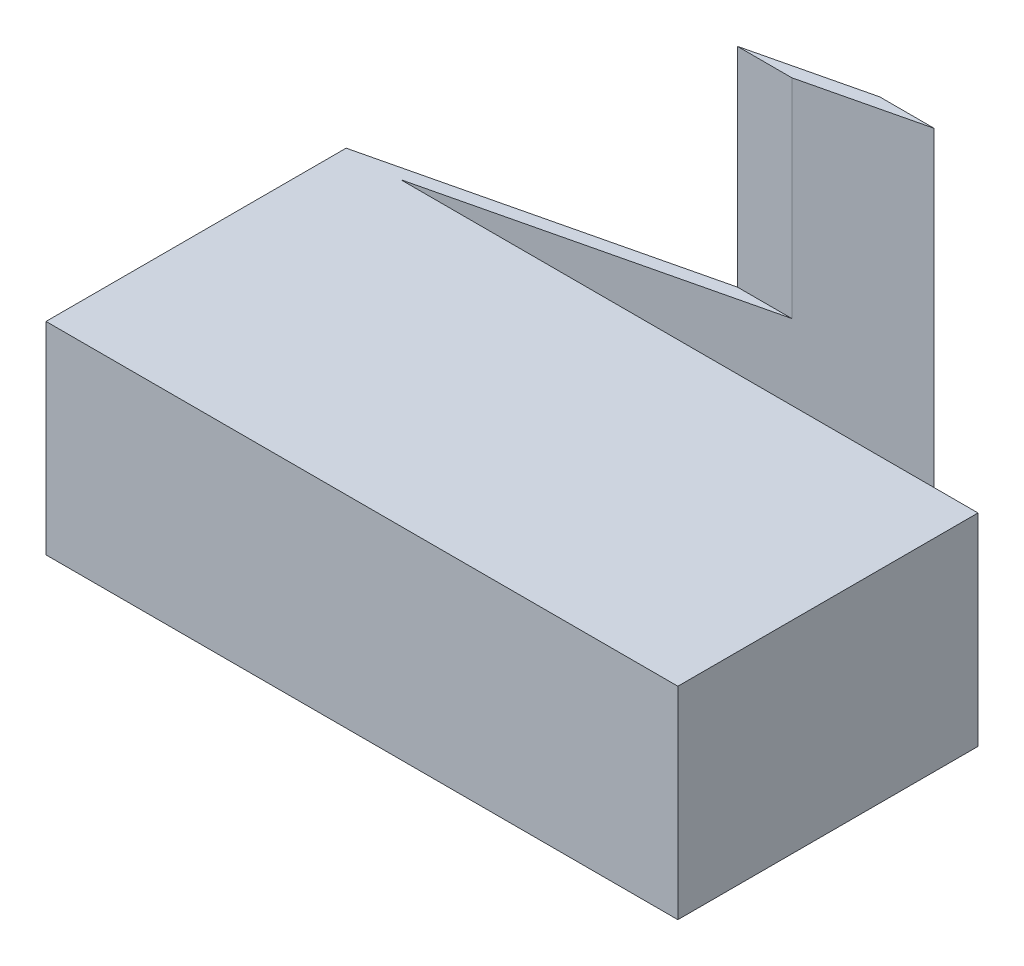
ISO-10303-21;
HEADER;
FILE_DESCRIPTION(('STEP AP214'),'2;1');
FILE_NAME('part.step','',(''),(''),'','','');
FILE_SCHEMA(('AUTOMOTIVE_DESIGN { 1 0 10303 214 1 1 1 1 }'));
ENDSEC;
DATA;
#1=APPLICATION_CONTEXT('core data for automotive mechanical design processes');
#2=APPLICATION_PROTOCOL_DEFINITION('international standard','automotive_design',2000,#1);
#3=PRODUCT_CONTEXT('',#1,'mechanical');
#4=PRODUCT('Part','Part','',(#3));
#5=PRODUCT_RELATED_PRODUCT_CATEGORY('part','',(#4));
#6=PRODUCT_DEFINITION_FORMATION('','',#4);
#7=PRODUCT_DEFINITION_CONTEXT('part definition',#1,'design');
#8=PRODUCT_DEFINITION('design','',#6,#7);
#9=PRODUCT_DEFINITION_SHAPE('','',#8);
#10=(LENGTH_UNIT() NAMED_UNIT(*) SI_UNIT(.MILLI.,.METRE.));
#11=(NAMED_UNIT(*) PLANE_ANGLE_UNIT() SI_UNIT($,.RADIAN.));
#12=(NAMED_UNIT(*) SI_UNIT($,.STERADIAN.) SOLID_ANGLE_UNIT());
#13=UNCERTAINTY_MEASURE_WITH_UNIT(LENGTH_MEASURE(1.E-05),#10,'distance_accuracy_value','');
#14=(GEOMETRIC_REPRESENTATION_CONTEXT(3) GLOBAL_UNCERTAINTY_ASSIGNED_CONTEXT((#13)) GLOBAL_UNIT_ASSIGNED_CONTEXT((#10,
#11,#12)) REPRESENTATION_CONTEXT('',''));
#15=CARTESIAN_POINT('',(0.,0.,0.));
#16=DIRECTION('',(0.,0.,1.));
#17=DIRECTION('',(1.,0.,0.));
#18=AXIS2_PLACEMENT_3D('',#15,#16,#17);
#19=CARTESIAN_POINT('',(0.,6.4,0.));
#20=DIRECTION('',(0.,1.,0.));
#21=DIRECTION('',(0.,0.,1.));
#22=AXIS2_PLACEMENT_3D('',#19,#20,#21);
#23=PLANE('',#22);
#24=DIRECTION('',(0.972757517348018,0.,-0.231824960784901));
#25=VECTOR('',#24,1.);
#26=CARTESIAN_POINT('',(-1.51586813834925,6.4,-6.36071336708113));
#27=LINE('',#26,#25);
#28=CARTESIAN_POINT('',(-8.27456026026835,6.4,-4.75));
#29=VERTEX_POINT('',#28);
#30=CARTESIAN_POINT('',(1.72543973973165,6.4,-7.13317316135386));
#31=VERTEX_POINT('',#30);
#32=EDGE_CURVE('E223',#29,#31,#27,.T.);
#33=ORIENTED_EDGE('',*,*,#32,.T.);
#34=DIRECTION('',(-1.,0.,0.));
#35=VECTOR('',#34,1.);
#36=CARTESIAN_POINT('',(0.,6.4,-7.13317316135386));
#37=LINE('',#36,#35);
#38=CARTESIAN_POINT('',(0.,6.4,-7.13317316135386));
#39=VERTEX_POINT('',#38);
#40=EDGE_CURVE('E12',#31,#39,#37,.T.);
#41=ORIENTED_EDGE('',*,*,#40,.T.);
#42=DIRECTION('',(0.972757517348018,0.,-0.231824960784901));
#43=VECTOR('',#42,1.);
#44=CARTESIAN_POINT('',(-1.60859812266321,6.4,-6.74981637402034));
#45=LINE('',#44,#43);
#46=CARTESIAN_POINT('',(-10.,6.4,-4.75));
#47=VERTEX_POINT('',#46);
#48=EDGE_CURVE('E219',#47,#39,#45,.T.);
#49=ORIENTED_EDGE('',*,*,#48,.F.);
#50=DIRECTION('',(0.,0.,1.));
#51=VECTOR('',#50,1.);
#52=CARTESIAN_POINT('',(-10.,6.4,-4.75));
#53=LINE('',#52,#51);
#54=CARTESIAN_POINT('',(-10.,6.4,4.75));
#55=VERTEX_POINT('',#54);
#56=EDGE_CURVE('E178',#47,#55,#53,.T.);
#57=ORIENTED_EDGE('',*,*,#56,.T.);
#58=DIRECTION('',(1.,0.,0.));
#59=VECTOR('',#58,1.);
#60=CARTESIAN_POINT('',(-10.,6.4,4.75));
#61=LINE('',#60,#59);
#62=CARTESIAN_POINT('',(10.,6.4,4.75));
#63=VERTEX_POINT('',#62);
#64=EDGE_CURVE('E171',#55,#63,#61,.T.);
#65=ORIENTED_EDGE('',*,*,#64,.T.);
#66=DIRECTION('',(0.,0.,1.));
#67=VECTOR('',#66,1.);
#68=CARTESIAN_POINT('',(10.,6.4,-4.75));
#69=LINE('',#68,#67);
#70=CARTESIAN_POINT('',(10.,6.4,-4.75));
#71=VERTEX_POINT('',#70);
#72=EDGE_CURVE('E211',#71,#63,#69,.T.);
#73=ORIENTED_EDGE('',*,*,#72,.F.);
#74=DIRECTION('',(1.,0.,0.));
#75=VECTOR('',#74,1.);
#76=CARTESIAN_POINT('',(-10.,6.4,-4.75));
#77=LINE('',#76,#75);
#78=EDGE_CURVE('E212',#29,#71,#77,.T.);
#79=ORIENTED_EDGE('',*,*,#78,.F.);
#80=EDGE_LOOP('',(#33,#41,#49,#57,#65,#73,#79));
#81=FACE_BOUND('',#80,.T.);
#82=ADVANCED_FACE('F107',(#81),#23,.T.);
#83=CARTESIAN_POINT('',(0.,0.,0.));
#84=DIRECTION('',(0.,1.,0.));
#85=DIRECTION('',(0.,0.,1.));
#86=AXIS2_PLACEMENT_3D('',#83,#84,#85);
#87=PLANE('',#86);
#88=DIRECTION('',(1.,0.,0.));
#89=VECTOR('',#88,1.);
#90=CARTESIAN_POINT('',(3.63728013013417,0.,-8.));
#91=LINE('',#90,#89);
#92=CARTESIAN_POINT('',(3.63728013013417,0.,-8.));
#93=VERTEX_POINT('',#92);
#94=CARTESIAN_POINT('',(5.36271986986582,0.,-8.));
#95=VERTEX_POINT('',#94);
#96=EDGE_CURVE('E195',#93,#95,#91,.T.);
#97=ORIENTED_EDGE('',*,*,#96,.T.);
#98=DIRECTION('',(0.972757517348018,0.,-0.231824960784901));
#99=VECTOR('',#98,1.);
#100=CARTESIAN_POINT('',(-1.51586813834925,0.,-6.36071336708113));
#101=LINE('',#100,#99);
#102=CARTESIAN_POINT('',(-8.27456026026835,0.,-4.75));
#103=VERTEX_POINT('',#102);
#104=EDGE_CURVE('E224',#103,#95,#101,.T.);
#105=ORIENTED_EDGE('',*,*,#104,.F.);
#106=DIRECTION('',(1.,0.,0.));
#107=VECTOR('',#106,1.);
#108=CARTESIAN_POINT('',(-10.,0.,-4.75));
#109=LINE('',#108,#107);
#110=CARTESIAN_POINT('',(10.,0.,-4.75));
#111=VERTEX_POINT('',#110);
#112=EDGE_CURVE('E157',#103,#111,#109,.T.);
#113=ORIENTED_EDGE('',*,*,#112,.T.);
#114=DIRECTION('',(0.,0.,1.));
#115=VECTOR('',#114,1.);
#116=CARTESIAN_POINT('',(10.,0.,-4.75));
#117=LINE('',#116,#115);
#118=CARTESIAN_POINT('',(10.,0.,4.75));
#119=VERTEX_POINT('',#118);
#120=EDGE_CURVE('E183',#111,#119,#117,.T.);
#121=ORIENTED_EDGE('',*,*,#120,.T.);
#122=DIRECTION('',(1.,0.,0.));
#123=VECTOR('',#122,1.);
#124=CARTESIAN_POINT('',(-10.,0.,4.75));
#125=LINE('',#124,#123);
#126=CARTESIAN_POINT('',(-10.,0.,4.75));
#127=VERTEX_POINT('',#126);
#128=EDGE_CURVE('E176',#127,#119,#125,.T.);
#129=ORIENTED_EDGE('',*,*,#128,.F.);
#130=DIRECTION('',(0.,0.,1.));
#131=VECTOR('',#130,1.);
#132=CARTESIAN_POINT('',(-10.,0.,-4.75));
#133=LINE('',#132,#131);
#134=CARTESIAN_POINT('',(-10.,0.,-4.75));
#135=VERTEX_POINT('',#134);
#136=EDGE_CURVE('E163',#135,#127,#133,.T.);
#137=ORIENTED_EDGE('',*,*,#136,.F.);
#138=DIRECTION('',(0.972757517348018,0.,-0.231824960784901));
#139=VECTOR('',#138,1.);
#140=CARTESIAN_POINT('',(-1.60859812266321,0.,-6.74981637402034));
#141=LINE('',#140,#139);
#142=EDGE_CURVE('E209',#135,#93,#141,.T.);
#143=ORIENTED_EDGE('',*,*,#142,.T.);
#144=EDGE_LOOP('',(#97,#105,#113,#121,#129,#137,#143));
#145=FACE_BOUND('',#144,.T.);
#146=ADVANCED_FACE('F181',(#145),#87,.F.);
#147=CARTESIAN_POINT('',(-1.60859812266321,6.4,-6.74981637402034));
#148=DIRECTION('',(-0.231824960784901,0.,-0.972757517348018));
#149=DIRECTION('',(-0.972757517348018,0.,0.231824960784901));
#150=AXIS2_PLACEMENT_3D('',#147,#148,#149);
#151=PLANE('',#150);
#152=DIRECTION('',(0.,-1.,0.));
#153=VECTOR('',#152,1.);
#154=CARTESIAN_POINT('',(3.63728013013417,6.4,-8.));
#155=LINE('',#154,#153);
#156=CARTESIAN_POINT('',(3.63728013013417,13.,-8.));
#157=VERTEX_POINT('',#156);
#158=EDGE_CURVE('E198',#157,#93,#155,.T.);
#159=ORIENTED_EDGE('',*,*,#158,.T.);
#160=ORIENTED_EDGE('',*,*,#142,.F.);
#161=DIRECTION('',(0.,-1.,0.));
#162=VECTOR('',#161,1.);
#163=CARTESIAN_POINT('',(-10.,6.4,-4.75));
#164=LINE('',#163,#162);
#165=EDGE_CURVE('E116',#47,#135,#164,.T.);
#166=ORIENTED_EDGE('',*,*,#165,.F.);
#167=ORIENTED_EDGE('',*,*,#48,.T.);
#168=DIRECTION('',(0.,-1.,0.));
#169=VECTOR('',#168,1.);
#170=CARTESIAN_POINT('',(0.,13.,-7.13317316135386));
#171=LINE('',#170,#169);
#172=CARTESIAN_POINT('',(0.,13.,-7.13317316135386));
#173=VERTEX_POINT('',#172);
#174=EDGE_CURVE('E184',#173,#39,#171,.T.);
#175=ORIENTED_EDGE('',*,*,#174,.F.);
#176=DIRECTION('',(0.972757517348018,0.,-0.231824960784901));
#177=VECTOR('',#176,1.);
#178=CARTESIAN_POINT('',(-1.60859812266321,13.,-6.74981637402034));
#179=LINE('',#178,#177);
#180=EDGE_CURVE('E350',#173,#157,#179,.T.);
#181=ORIENTED_EDGE('',*,*,#180,.T.);
#182=EDGE_LOOP('',(#159,#160,#166,#167,#175,#181));
#183=FACE_BOUND('',#182,.T.);
#184=ADVANCED_FACE('F243',(#183),#151,.T.);
#185=CARTESIAN_POINT('',(-1.51586813834925,6.4,-6.36071336708113));
#186=DIRECTION('',(-0.231824960784901,0.,-0.972757517348018));
#187=DIRECTION('',(-0.972757517348018,0.,0.231824960784901));
#188=AXIS2_PLACEMENT_3D('',#185,#186,#187);
#189=PLANE('',#188);
#190=DIRECTION('',(0.,-1.,0.));
#191=VECTOR('',#190,1.);
#192=CARTESIAN_POINT('',(5.36271986986582,6.4,-8.));
#193=LINE('',#192,#191);
#194=CARTESIAN_POINT('',(5.36271986986582,13.,-8.));
#195=VERTEX_POINT('',#194);
#196=EDGE_CURVE('E202',#195,#95,#193,.T.);
#197=ORIENTED_EDGE('',*,*,#196,.F.);
#198=DIRECTION('',(0.972757517348018,0.,-0.231824960784901));
#199=VECTOR('',#198,1.);
#200=CARTESIAN_POINT('',(-1.51586813834925,13.,-6.36071336708113));
#201=LINE('',#200,#199);
#202=CARTESIAN_POINT('',(1.72543973973165,13.,-7.13317316135386));
#203=VERTEX_POINT('',#202);
#204=EDGE_CURVE('E361',#203,#195,#201,.T.);
#205=ORIENTED_EDGE('',*,*,#204,.F.);
#206=DIRECTION('',(0.,-1.,0.));
#207=VECTOR('',#206,1.);
#208=CARTESIAN_POINT('',(1.72543973973165,13.,-7.13317316135386));
#209=LINE('',#208,#207);
#210=EDGE_CURVE('E188',#203,#31,#209,.T.);
#211=ORIENTED_EDGE('',*,*,#210,.T.);
#212=ORIENTED_EDGE('',*,*,#32,.F.);
#213=DIRECTION('',(0.,-1.,0.));
#214=VECTOR('',#213,1.);
#215=CARTESIAN_POINT('',(-8.27456026026835,6.4,-4.75));
#216=LINE('',#215,#214);
#217=EDGE_CURVE('E124',#29,#103,#216,.T.);
#218=ORIENTED_EDGE('',*,*,#217,.T.);
#219=ORIENTED_EDGE('',*,*,#104,.T.);
#220=EDGE_LOOP('',(#197,#205,#211,#212,#218,#219));
#221=FACE_BOUND('',#220,.T.);
#222=ADVANCED_FACE('F233',(#221),#189,.F.);
#223=CARTESIAN_POINT('',(10.,6.4,-4.75));
#224=DIRECTION('',(1.,0.,0.));
#225=DIRECTION('',(0.,0.,-1.));
#226=AXIS2_PLACEMENT_3D('',#223,#224,#225);
#227=PLANE('',#226);
#228=ORIENTED_EDGE('',*,*,#120,.F.);
#229=DIRECTION('',(0.,-1.,0.));
#230=VECTOR('',#229,1.);
#231=CARTESIAN_POINT('',(10.,6.4,-4.75));
#232=LINE('',#231,#230);
#233=EDGE_CURVE('E177',#71,#111,#232,.T.);
#234=ORIENTED_EDGE('',*,*,#233,.F.);
#235=ORIENTED_EDGE('',*,*,#72,.T.);
#236=DIRECTION('',(0.,-1.,0.));
#237=VECTOR('',#236,1.);
#238=CARTESIAN_POINT('',(10.,6.4,4.75));
#239=LINE('',#238,#237);
#240=EDGE_CURVE('E194',#63,#119,#239,.T.);
#241=ORIENTED_EDGE('',*,*,#240,.T.);
#242=EDGE_LOOP('',(#228,#234,#235,#241));
#243=FACE_BOUND('',#242,.T.);
#244=ADVANCED_FACE('F236',(#243),#227,.T.);
#245=CARTESIAN_POINT('',(-10.,6.4,-4.75));
#246=DIRECTION('',(0.,0.,-1.));
#247=DIRECTION('',(-1.,0.,0.));
#248=AXIS2_PLACEMENT_3D('',#245,#246,#247);
#249=PLANE('',#248);
#250=ORIENTED_EDGE('',*,*,#217,.F.);
#251=ORIENTED_EDGE('',*,*,#78,.T.);
#252=ORIENTED_EDGE('',*,*,#233,.T.);
#253=ORIENTED_EDGE('',*,*,#112,.F.);
#254=EDGE_LOOP('',(#250,#251,#252,#253));
#255=FACE_BOUND('',#254,.T.);
#256=ADVANCED_FACE('F235',(#255),#249,.T.);
#257=CARTESIAN_POINT('',(-10.,6.4,-4.75));
#258=DIRECTION('',(1.,0.,0.));
#259=DIRECTION('',(0.,0.,-1.));
#260=AXIS2_PLACEMENT_3D('',#257,#258,#259);
#261=PLANE('',#260);
#262=ORIENTED_EDGE('',*,*,#136,.T.);
#263=DIRECTION('',(0.,-1.,0.));
#264=VECTOR('',#263,1.);
#265=CARTESIAN_POINT('',(-10.,6.4,4.75));
#266=LINE('',#265,#264);
#267=EDGE_CURVE('E167',#55,#127,#266,.T.);
#268=ORIENTED_EDGE('',*,*,#267,.F.);
#269=ORIENTED_EDGE('',*,*,#56,.F.);
#270=ORIENTED_EDGE('',*,*,#165,.T.);
#271=EDGE_LOOP('',(#262,#268,#269,#270));
#272=FACE_BOUND('',#271,.T.);
#273=ADVANCED_FACE('F165',(#272),#261,.F.);
#274=CARTESIAN_POINT('',(-10.,6.4,4.75));
#275=DIRECTION('',(0.,0.,-1.));
#276=DIRECTION('',(-1.,0.,0.));
#277=AXIS2_PLACEMENT_3D('',#274,#275,#276);
#278=PLANE('',#277);
#279=ORIENTED_EDGE('',*,*,#128,.T.);
#280=ORIENTED_EDGE('',*,*,#240,.F.);
#281=ORIENTED_EDGE('',*,*,#64,.F.);
#282=ORIENTED_EDGE('',*,*,#267,.T.);
#283=EDGE_LOOP('',(#279,#280,#281,#282));
#284=FACE_BOUND('',#283,.T.);
#285=ADVANCED_FACE('F109',(#284),#278,.F.);
#286=CARTESIAN_POINT('',(3.63728013013417,6.4,-8.));
#287=DIRECTION('',(0.,0.,-1.));
#288=DIRECTION('',(-1.,0.,0.));
#289=AXIS2_PLACEMENT_3D('',#286,#287,#288);
#290=PLANE('',#289);
#291=ORIENTED_EDGE('',*,*,#96,.F.);
#292=ORIENTED_EDGE('',*,*,#158,.F.);
#293=DIRECTION('',(1.,0.,0.));
#294=VECTOR('',#293,1.);
#295=CARTESIAN_POINT('',(0.,13.,-8.));
#296=LINE('',#295,#294);
#297=EDGE_CURVE('E358',#157,#195,#296,.T.);
#298=ORIENTED_EDGE('',*,*,#297,.T.);
#299=ORIENTED_EDGE('',*,*,#196,.T.);
#300=EDGE_LOOP('',(#291,#292,#298,#299));
#301=FACE_BOUND('',#300,.T.);
#302=ADVANCED_FACE('F245',(#301),#290,.T.);
#303=CARTESIAN_POINT('',(0.,13.,-7.13317316135386));
#304=DIRECTION('',(0.,0.,-1.));
#305=DIRECTION('',(-1.,0.,0.));
#306=AXIS2_PLACEMENT_3D('',#303,#304,#305);
#307=PLANE('',#306);
#308=ORIENTED_EDGE('',*,*,#40,.F.);
#309=ORIENTED_EDGE('',*,*,#210,.F.);
#310=DIRECTION('',(1.,0.,0.));
#311=VECTOR('',#310,1.);
#312=CARTESIAN_POINT('',(0.,13.,-7.13317316135386));
#313=LINE('',#312,#311);
#314=EDGE_CURVE('E354',#173,#203,#313,.T.);
#315=ORIENTED_EDGE('',*,*,#314,.F.);
#316=ORIENTED_EDGE('',*,*,#174,.T.);
#317=EDGE_LOOP('',(#308,#309,#315,#316));
#318=FACE_BOUND('',#317,.T.);
#319=ADVANCED_FACE('F253',(#318),#307,.F.);
#320=CARTESIAN_POINT('',(0.,13.,0.));
#321=DIRECTION('',(0.,1.,0.));
#322=DIRECTION('',(0.,0.,1.));
#323=AXIS2_PLACEMENT_3D('',#320,#321,#322);
#324=PLANE('',#323);
#325=ORIENTED_EDGE('',*,*,#180,.F.);
#326=ORIENTED_EDGE('',*,*,#314,.T.);
#327=ORIENTED_EDGE('',*,*,#204,.T.);
#328=ORIENTED_EDGE('',*,*,#297,.F.);
#329=EDGE_LOOP('',(#325,#326,#327,#328));
#330=FACE_BOUND('',#329,.T.);
#331=ADVANCED_FACE('F278',(#330),#324,.T.);
#332=CLOSED_SHELL('',(#82,#146,#184,#222,#244,#256,#273,#285,#302,#319,#331));
#333=MANIFOLD_SOLID_BREP('B2',#332);
#334=ADVANCED_BREP_SHAPE_REPRESENTATION('',(#18,#333),#14);
#335=SHAPE_DEFINITION_REPRESENTATION(#9,#334);
ENDSEC;
END-ISO-10303-21;
